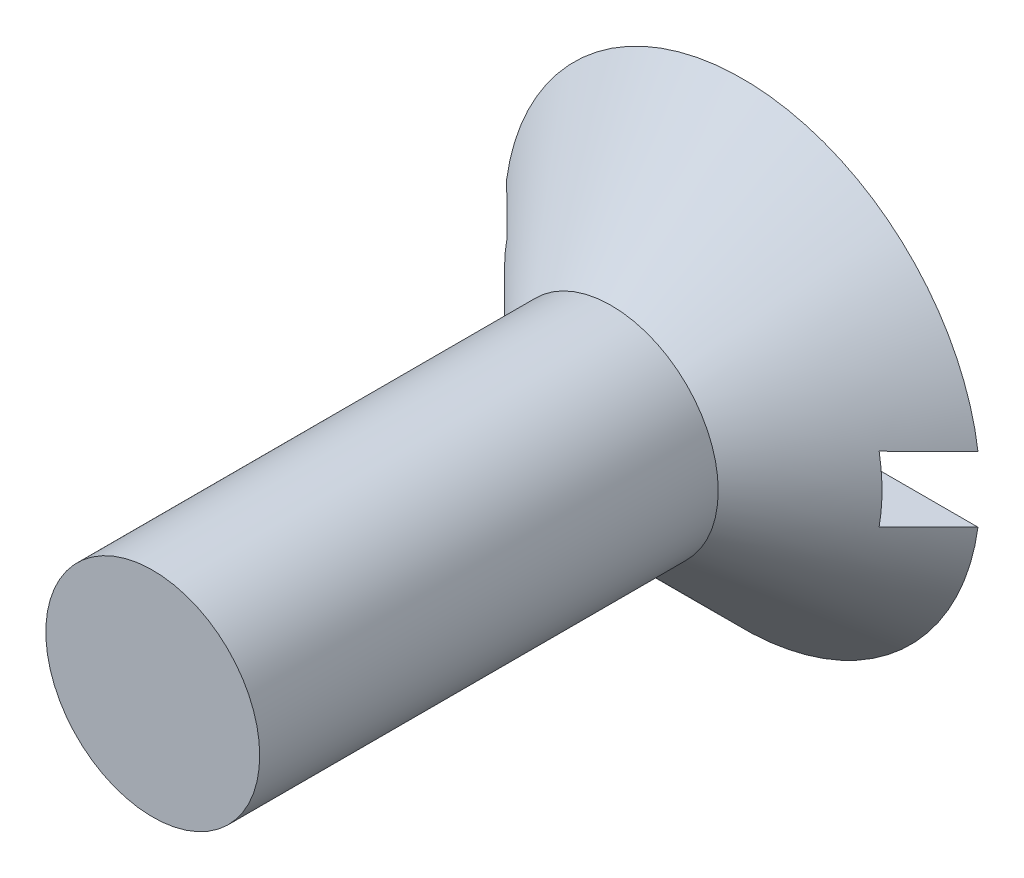
ISO-10303-21;
HEADER;
FILE_DESCRIPTION(('STEP AP214'),'2;1');
FILE_NAME('part.step','',(''),(''),'','','');
FILE_SCHEMA(('AUTOMOTIVE_DESIGN { 1 0 10303 214 1 1 1 1 }'));
ENDSEC;
DATA;
#1=APPLICATION_CONTEXT('core data for automotive mechanical design processes');
#2=APPLICATION_PROTOCOL_DEFINITION('international standard','automotive_design',2000,#1);
#3=PRODUCT_CONTEXT('',#1,'mechanical');
#4=PRODUCT('Part','Part','',(#3));
#5=PRODUCT_RELATED_PRODUCT_CATEGORY('part','',(#4));
#6=PRODUCT_DEFINITION_FORMATION('','',#4);
#7=PRODUCT_DEFINITION_CONTEXT('part definition',#1,'design');
#8=PRODUCT_DEFINITION('design','',#6,#7);
#9=PRODUCT_DEFINITION_SHAPE('','',#8);
#10=(LENGTH_UNIT() NAMED_UNIT(*) SI_UNIT(.MILLI.,.METRE.));
#11=(NAMED_UNIT(*) PLANE_ANGLE_UNIT() SI_UNIT($,.RADIAN.));
#12=(NAMED_UNIT(*) SI_UNIT($,.STERADIAN.) SOLID_ANGLE_UNIT());
#13=UNCERTAINTY_MEASURE_WITH_UNIT(LENGTH_MEASURE(1.E-05),#10,'distance_accuracy_value','');
#14=(GEOMETRIC_REPRESENTATION_CONTEXT(3) GLOBAL_UNCERTAINTY_ASSIGNED_CONTEXT((#13)) GLOBAL_UNIT_ASSIGNED_CONTEXT((#10,
#11,#12)) REPRESENTATION_CONTEXT('',''));
#15=CARTESIAN_POINT('',(0.,0.,0.));
#16=DIRECTION('',(0.,0.,1.));
#17=DIRECTION('',(1.,0.,0.));
#18=AXIS2_PLACEMENT_3D('',#15,#16,#17);
#19=CARTESIAN_POINT('',(0.,0.,0.));
#20=DIRECTION('',(0.,0.,1.));
#21=DIRECTION('',(1.,0.,0.));
#22=AXIS2_PLACEMENT_3D('',#19,#20,#21);
#23=PLANE('',#22);
#24=CARTESIAN_POINT('',(0.,0.,0.));
#25=DIRECTION('',(0.,0.,1.));
#26=DIRECTION('',(1.,0.,0.));
#27=AXIS2_PLACEMENT_3D('',#24,#25,#26);
#28=CIRCLE('',#27,7.265);
#29=CARTESIAN_POINT('',(-7.19584776103553,-1.,0.));
#30=VERTEX_POINT('',#29);
#31=CARTESIAN_POINT('',(7.19584776103553,-1.,0.));
#32=VERTEX_POINT('',#31);
#33=EDGE_CURVE('E94',#30,#32,#28,.T.);
#34=ORIENTED_EDGE('',*,*,#33,.F.);
#35=DIRECTION('',(-1.,0.,0.));
#36=VECTOR('',#35,1.);
#37=CARTESIAN_POINT('',(7.5,-1.,0.));
#38=LINE('',#37,#36);
#39=EDGE_CURVE('E88',#32,#30,#38,.T.);
#40=ORIENTED_EDGE('',*,*,#39,.F.);
#41=EDGE_LOOP('',(#34,#40));
#42=FACE_BOUND('',#41,.T.);
#43=ADVANCED_FACE('F33',(#42),#23,.F.);
#44=CARTESIAN_POINT('',(7.19584776103553,1.,0.));
#45=VERTEX_POINT('',#44);
#46=CARTESIAN_POINT('',(-7.19584776103553,1.,0.));
#47=VERTEX_POINT('',#46);
#48=EDGE_CURVE('E87',#45,#47,#28,.T.);
#49=ORIENTED_EDGE('',*,*,#48,.F.);
#50=DIRECTION('',(1.,0.,0.));
#51=VECTOR('',#50,1.);
#52=CARTESIAN_POINT('',(7.5,1.,0.));
#53=LINE('',#52,#51);
#54=EDGE_CURVE('E80',#47,#45,#53,.T.);
#55=ORIENTED_EDGE('',*,*,#54,.F.);
#56=EDGE_LOOP('',(#49,#55));
#57=FACE_BOUND('',#56,.T.);
#58=ADVANCED_FACE('F35',(#57),#23,.F.);
#59=CARTESIAN_POINT('',(0.,0.,0.));
#60=DIRECTION('',(0.,0.,-1.));
#61=DIRECTION('',(-1.,0.,0.));
#62=AXIS2_PLACEMENT_3D('',#59,#60,#61);
#63=CONICAL_SURFACE('',#62,7.265,0.785398163397447);
#64=CARTESIAN_POINT('',(0.,0.,1.5));
#65=DIRECTION('',(0.,0.,1.));
#66=DIRECTION('',(1.,0.,0.));
#67=AXIS2_PLACEMENT_3D('',#64,#65,#66);
#68=CIRCLE('',#67,5.765);
#69=CARTESIAN_POINT('',(-5.67760733055748,1.,1.5));
#70=VERTEX_POINT('',#69);
#71=CARTESIAN_POINT('',(-5.67760733055748,-1.,1.5));
#72=VERTEX_POINT('',#71);
#73=EDGE_CURVE('E59',#70,#72,#68,.T.);
#74=ORIENTED_EDGE('',*,*,#73,.T.);
#75=CARTESIAN_POINT('',(15.9983096562298,-1.,-8.76453249026987));
#76=CARTESIAN_POINT('',(15.4557890476047,-1.,-8.22307645823843));
#77=CARTESIAN_POINT('',(14.9132222529746,-1.,-7.6816666771709));
#78=CARTESIAN_POINT('',(13.8279300255945,-1.,-6.59898819730665));
#79=CARTESIAN_POINT('',(13.2852045903701,-1.,-6.0577195009906));
#80=CARTESIAN_POINT('',(12.1993480385048,-1.,-4.97519157531993));
#81=CARTESIAN_POINT('',(11.6562168460853,-1.,-4.43393242196489));
#82=CARTESIAN_POINT('',(10.56964954414,-1.,-3.35173778518174));
#83=CARTESIAN_POINT('',(10.0262134396754,-1.,-2.81080229667209));
#84=CARTESIAN_POINT('',(8.91636492247909,-1.,-1.70706536962148));
#85=CARTESIAN_POINT('',(8.34993173988591,-1.,-1.14428480390768));
#86=CARTESIAN_POINT('',(7.49954017689733,-1.,-0.300833009918018));
#87=CARTESIAN_POINT('',(7.21594550764785,-1.,-0.0197951541063598));
#88=CARTESIAN_POINT('',(6.64840977604114,-1.,0.541927813486278));
#89=CARTESIAN_POINT('',(6.3644687154152,-1.,0.822612927016182));
#90=CARTESIAN_POINT('',(5.79614600574115,-1.,1.38340433997221));
#91=CARTESIAN_POINT('',(5.51176447505103,-1.,1.66351075924745));
#92=CARTESIAN_POINT('',(4.94220523196698,-1.,2.22292392481321));
#93=CARTESIAN_POINT('',(4.65702750445391,-1.,2.50223065571147));
#94=CARTESIAN_POINT('',(4.08539864007565,-1.,3.0594910862045));
#95=CARTESIAN_POINT('',(3.79894761970735,-1.,3.33744490489673));
#96=CARTESIAN_POINT('',(3.36742298623154,-1.,3.75244649130769));
#97=CARTESIAN_POINT('',(3.22327563390415,-1.,3.89045674274514));
#98=CARTESIAN_POINT('',(2.93407333321084,-1.,4.16552238124412));
#99=CARTESIAN_POINT('',(2.78901839595447,-1.,4.30257777995054));
#100=CARTESIAN_POINT('',(2.60420862865773,-1.,4.4754272339185));
#101=CARTESIAN_POINT('',(2.56509643854745,-1.,4.51190850437038));
#102=CARTESIAN_POINT('',(2.48675714779063,-1.,4.58474771323964));
#103=CARTESIAN_POINT('',(2.44753004678473,-1.,4.62110565127055));
#104=CARTESIAN_POINT('',(2.32965338430296,-1.,4.72997048279937));
#105=CARTESIAN_POINT('',(2.25080958589758,-1.,4.80226734208624));
#106=CARTESIAN_POINT('',(2.09275614932205,-1.,4.94583310653702));
#107=CARTESIAN_POINT('',(2.01354918103263,-1.,5.01710494163445));
#108=CARTESIAN_POINT('',(1.85422849249175,-1.,5.15862082160274));
#109=CARTESIAN_POINT('',(1.77411480474968,-1.,5.22886490311678));
#110=CARTESIAN_POINT('',(1.58590225366499,-1.,5.39095618793656));
#111=CARTESIAN_POINT('',(1.4773225357401,-1.,5.48225313997696));
#112=CARTESIAN_POINT('',(1.31134376059791,-1.,5.6161921741658));
#113=CARTESIAN_POINT('',(1.25528814192237,-1.,5.66049417970092));
#114=CARTESIAN_POINT('',(1.14196556107815,-1.,5.7475152186001));
#115=CARTESIAN_POINT('',(1.08469876181978,-1.,5.79023446275368));
#116=CARTESIAN_POINT('',(0.967613118494528,-1.,5.8741096784269));
#117=CARTESIAN_POINT('',(0.907768002224852,-1.,5.91522928963622));
#118=CARTESIAN_POINT('',(0.785742515037642,-1.,5.99408800409892));
#119=CARTESIAN_POINT('',(0.72355925106915,-1.,6.03182270977622));
#120=CARTESIAN_POINT('',(0.59692783330777,-1.,6.10157843721879));
#121=CARTESIAN_POINT('',(0.532513341037853,-1.,6.13365937476086));
#122=CARTESIAN_POINT('',(0.400212712405025,-1.,6.18953804214339));
#123=CARTESIAN_POINT('',(0.332338512899856,-1.,6.21336229882671));
#124=CARTESIAN_POINT('',(0.230146192650823,-1.,6.23934779198065));
#125=CARTESIAN_POINT('',(0.197045598105046,-1.,6.24630409711196));
#126=CARTESIAN_POINT('',(0.130328550980707,-1.,6.25707955216794));
#127=CARTESIAN_POINT('',(0.096712147208895,-1.,6.26089899706559));
#128=CARTESIAN_POINT('',(0.0293528962342801,-1.,6.26513184684099));
#129=CARTESIAN_POINT('',(-0.0043893506239799,-1.,6.26555457204965));
#130=CARTESIAN_POINT('',(-0.0717374624353494,-1.,6.26299712959929));
#131=CARTESIAN_POINT('',(-0.105343315977113,-1.,6.26001668287271));
#132=CARTESIAN_POINT('',(-0.2049244462689,-1.,6.24631485812493));
#133=CARTESIAN_POINT('',(-0.270280804754342,-1.,6.23086607143081));
#134=CARTESIAN_POINT('',(-0.366030087054957,-1.,6.20055766001401));
#135=CARTESIAN_POINT('',(-0.397655355234753,-1.,6.18922164128592));
#136=CARTESIAN_POINT('',(-0.460133893136234,-1.,6.1645884798906));
#137=CARTESIAN_POINT('',(-0.490987315028977,-1.,6.15129172740731));
#138=CARTESIAN_POINT('',(-0.582573972400191,-1.,6.1089549739208));
#139=CARTESIAN_POINT('',(-0.642190739233886,-1.,6.07751723536106));
#140=CARTESIAN_POINT('',(-0.759048768503682,-1.,6.01046061904964));
#141=CARTESIAN_POINT('',(-0.816287030885016,-1.,5.97483666560303));
#142=CARTESIAN_POINT('',(-0.929128702049539,-1.,5.90064340100099));
#143=CARTESIAN_POINT('',(-0.984724766945417,-1.,5.8620630202428));
#144=CARTESIAN_POINT('',(-1.09446906586818,-1.,5.78296783074429));
#145=CARTESIAN_POINT('',(-1.1486179892555,-1.,5.74245396961619));
#146=CARTESIAN_POINT('',(-1.25639642418024,-1.,5.65959234865027));
#147=CARTESIAN_POINT('',(-1.31001451009564,-1.,5.61722979841428));
#148=CARTESIAN_POINT('',(-1.41640290679354,-1.,5.53144621073864));
#149=CARTESIAN_POINT('',(-1.46917312957924,-1.,5.48802506459328));
#150=CARTESIAN_POINT('',(-1.57391303615265,-1.,5.40049537283036));
#151=CARTESIAN_POINT('',(-1.62588440224883,-1.,5.35638883530661));
#152=CARTESIAN_POINT('',(-1.72929437221973,-1.,5.26756142000487));
#153=CARTESIAN_POINT('',(-1.78073299945704,-1.,5.22284056936862));
#154=CARTESIAN_POINT('',(-1.93221886800848,-1.,5.08988012428591));
#155=CARTESIAN_POINT('',(-2.03166628391237,-1.,5.00095760586113));
#156=CARTESIAN_POINT('',(-2.22946236636678,-1.,4.82189704116501));
#157=CARTESIAN_POINT('',(-2.32781099004341,-1.,4.73175894776378));
#158=CARTESIAN_POINT('',(-2.52373423455357,-1.,4.55062339597674));
#159=CARTESIAN_POINT('',(-2.62130876281639,-1.,4.4596258375787));
#160=CARTESIAN_POINT('',(-2.81587971500281,-1.,4.2770142958724));
#161=CARTESIAN_POINT('',(-2.91287613467913,-1.,4.18540030804584));
#162=CARTESIAN_POINT('',(-3.20345002105372,-1.,3.9096582041107));
#163=CARTESIAN_POINT('',(-3.39637895208703,-1.,3.72484708582212));
#164=CARTESIAN_POINT('',(-3.78117934483303,-1.,3.35415679971514));
#165=CARTESIAN_POINT('',(-3.97305087845589,-1.,3.16827770632708));
#166=CARTESIAN_POINT('',(-4.35411723555848,-1.,2.79774374490212));
#167=CARTESIAN_POINT('',(-4.54331917342883,-1.,2.61309619033792));
#168=CARTESIAN_POINT('',(-4.92125838088143,-1.,2.24331976434325));
#169=CARTESIAN_POINT('',(-5.10999564208373,-1.,2.05819088435457));
#170=CARTESIAN_POINT('',(-5.67553571499023,-1.,1.50246978172238));
#171=CARTESIAN_POINT('',(-6.05184188549579,-1.,1.13137229296147));
#172=CARTESIAN_POINT('',(-6.82468826303074,-1.,0.367701969882598));
#173=CARTESIAN_POINT('',(-7.22118596330345,-1.,-0.0249138309707284));
#174=CARTESIAN_POINT('',(-8.01367181290951,-1.,-0.810661051260227));
#175=CARTESIAN_POINT('',(-8.40965996108909,-1.,-1.20379247185985));
#176=CARTESIAN_POINT('',(-9.59728686641382,-1.,-2.38382349981805));
#177=CARTESIAN_POINT('',(-10.3884392451929,-1.,-3.17121247278217));
#178=CARTESIAN_POINT('',(-11.9830042385384,-1.,-4.75945288575233));
#179=CARTESIAN_POINT('',(-12.786406576409,-1.,-5.56031463722744));
#180=CARTESIAN_POINT('',(-13.9911504653319,-1.,-6.76181131211687));
#181=CARTESIAN_POINT('',(-14.3926327100833,-1.,-7.16230516533003));
#182=CARTESIAN_POINT('',(-15.1955224445601,-1.,-7.96336757118446));
#183=CARTESIAN_POINT('',(-15.5969299343066,-1.,-8.36393612380456));
#184=CARTESIAN_POINT('',(-15.9983096562298,-1.,-8.76453249026987));
#185=B_SPLINE_CURVE_WITH_KNOTS('',3,(#75,#76,#77,#78,#79,#80,#81,#82,#83,#84,#85,#86,#87,#88,
#89,#90,#91,#92,#93,#94,#95,#96,#97,#98,#99,#100,#101,#102,#103,#104,#105,#106,#107,#108,#109,
#110,#111,#112,#113,#114,#115,#116,#117,#118,#119,#120,#121,#122,#123,#124,#125,#126,#127,#128,
#129,#130,#131,#132,#133,#134,#135,#136,#137,#138,#139,#140,#141,#142,#143,#144,#145,#146,#147,
#148,#149,#150,#151,#152,#153,#154,#155,#156,#157,#158,#159,#160,#161,#162,#163,#164,#165,#166,
#167,#168,#169,#170,#171,#172,#173,#174,#175,#176,#177,#178,#179,#180,#181,#182,#183,#184),
.UNSPECIFIED.,.F.,.F.,(4,2,2,2,2,2,2,2,2,2,2,2,2,2,2,2,2,2,2,2,2,2,2,2,2,2,2,2,2,2,2,2,2,2,2,2,
2,2,2,2,2,2,2,2,2,2,2,2,2,2,2,2,2,2,4),(0.,2.29946283186032,4.59896368303261,6.8993063128362,
9.19961182627363,11.5950476639415,12.792826184088,13.990598741935,15.1880916209582,
16.3856073962152,17.5830157746448,18.1817017291386,18.7803803695339,18.9408351829286,
19.1012904986632,19.4222057446186,19.7418551115428,20.0614930538872,20.4869936755256,
20.7013203725826,20.9156184226064,21.1333752973453,21.3514110980078,21.566975489411,
21.7818407575202,21.883184523014,21.9845187576089,22.0855748437795,22.1866392173659,
22.3869450817582,22.4876930970714,22.5884210906256,22.7903272598044,22.9924808120406,
23.1954322077902,23.3982851371626,23.6032682523545,23.8082725063766,24.0127601258155,
24.2172387394063,24.6174372398075,25.0176513014433,25.4179125225543,25.8181766806981,
26.6196607890434,27.4210897012471,28.2142017587871,29.0073280160263,30.5928467725497,
32.2668290270087,33.9408150651803,37.2894155672119,40.6925777753173,42.3938272676703,
44.0950762783655),.UNSPECIFIED.);
#186=EDGE_CURVE('E11',#72,#30,#185,.T.);
#187=ORIENTED_EDGE('',*,*,#186,.T.);
#188=ORIENTED_EDGE('',*,*,#33,.T.);
#189=CARTESIAN_POINT('',(5.67760733055748,-1.,1.5));
#190=VERTEX_POINT('',#189);
#191=EDGE_CURVE('E37',#32,#190,#185,.T.);
#192=ORIENTED_EDGE('',*,*,#191,.T.);
#193=CARTESIAN_POINT('',(5.67760733055748,1.,1.5));
#194=VERTEX_POINT('',#193);
#195=EDGE_CURVE('E93',#190,#194,#68,.T.);
#196=ORIENTED_EDGE('',*,*,#195,.T.);
#197=CARTESIAN_POINT('',(-15.9983096562298,1.,-8.76453249026987));
#198=CARTESIAN_POINT('',(-15.4557890476047,1.,-8.22307645823843));
#199=CARTESIAN_POINT('',(-14.9132222529746,1.,-7.6816666771709));
#200=CARTESIAN_POINT('',(-13.8279300255945,1.,-6.59898819730665));
#201=CARTESIAN_POINT('',(-13.2852045903701,1.,-6.05771950099059));
#202=CARTESIAN_POINT('',(-12.1993480385048,1.,-4.97519157531993));
#203=CARTESIAN_POINT('',(-11.6562168460853,1.,-4.43393242196488));
#204=CARTESIAN_POINT('',(-10.56964954414,1.,-3.35173778518173));
#205=CARTESIAN_POINT('',(-10.0262134396754,1.,-2.81080229667208));
#206=CARTESIAN_POINT('',(-8.91636492247908,1.,-1.70706536962147));
#207=CARTESIAN_POINT('',(-8.3499317398859,1.,-1.14428480390767));
#208=CARTESIAN_POINT('',(-7.49954017689732,1.,-0.300833009918011));
#209=CARTESIAN_POINT('',(-7.21594550764784,1.,-0.0197951541063512));
#210=CARTESIAN_POINT('',(-6.64840977604113,1.,0.541927813486287));
#211=CARTESIAN_POINT('',(-6.36446871541519,1.,0.82261292701619));
#212=CARTESIAN_POINT('',(-5.79614600574114,1.,1.38340433997222));
#213=CARTESIAN_POINT('',(-5.51176447505102,1.,1.66351075924746));
#214=CARTESIAN_POINT('',(-4.94220523196697,1.,2.22292392481322));
#215=CARTESIAN_POINT('',(-4.6570275044539,1.,2.50223065571147));
#216=CARTESIAN_POINT('',(-4.08539864007564,1.,3.05949108620451));
#217=CARTESIAN_POINT('',(-3.79894761970735,1.,3.33744490489674));
#218=CARTESIAN_POINT('',(-3.36742298623154,1.,3.75244649130769));
#219=CARTESIAN_POINT('',(-3.22327563390414,1.,3.89045674274515));
#220=CARTESIAN_POINT('',(-2.93407333321084,1.,4.16552238124412));
#221=CARTESIAN_POINT('',(-2.78901839595447,1.,4.30257777995054));
#222=CARTESIAN_POINT('',(-2.60420862865773,1.,4.4754272339185));
#223=CARTESIAN_POINT('',(-2.56509643854745,1.,4.51190850437038));
#224=CARTESIAN_POINT('',(-2.48675714779064,1.,4.58474771323964));
#225=CARTESIAN_POINT('',(-2.44753004678473,1.,4.62110565127055));
#226=CARTESIAN_POINT('',(-2.32965338430296,1.,4.72997048279937));
#227=CARTESIAN_POINT('',(-2.25080958589758,1.,4.80226734208624));
#228=CARTESIAN_POINT('',(-2.09275614932205,1.,4.94583310653702));
#229=CARTESIAN_POINT('',(-2.01354918103263,1.,5.01710494163445));
#230=CARTESIAN_POINT('',(-1.85422849249175,1.,5.15862082160274));
#231=CARTESIAN_POINT('',(-1.77411480474967,1.,5.22886490311678));
#232=CARTESIAN_POINT('',(-1.58590225366499,1.,5.39095618793656));
#233=CARTESIAN_POINT('',(-1.4773225357401,1.,5.48225313997696));
#234=CARTESIAN_POINT('',(-1.31134376059791,1.,5.6161921741658));
#235=CARTESIAN_POINT('',(-1.25528814192237,1.,5.66049417970092));
#236=CARTESIAN_POINT('',(-1.14196556107815,1.,5.7475152186001));
#237=CARTESIAN_POINT('',(-1.08469876181978,1.,5.79023446275368));
#238=CARTESIAN_POINT('',(-0.967613118494526,1.,5.8741096784269));
#239=CARTESIAN_POINT('',(-0.90776800222485,1.,5.91522928963622));
#240=CARTESIAN_POINT('',(-0.78574251503764,1.,5.99408800409892));
#241=CARTESIAN_POINT('',(-0.723559251069148,1.,6.03182270977622));
#242=CARTESIAN_POINT('',(-0.596927833307768,1.,6.10157843721879));
#243=CARTESIAN_POINT('',(-0.532513341037851,1.,6.13365937476086));
#244=CARTESIAN_POINT('',(-0.400212712405023,1.,6.18953804214339));
#245=CARTESIAN_POINT('',(-0.332338512899854,1.,6.21336229882671));
#246=CARTESIAN_POINT('',(-0.230146192650822,1.,6.23934779198065));
#247=CARTESIAN_POINT('',(-0.197045598105046,1.,6.24630409711196));
#248=CARTESIAN_POINT('',(-0.130328550980708,1.,6.25707955216793));
#249=CARTESIAN_POINT('',(-0.0967121472088963,1.,6.26089899706559));
#250=CARTESIAN_POINT('',(-0.0293528962342817,1.,6.26513184684099));
#251=CARTESIAN_POINT('',(0.00438935062397831,1.,6.26555457204965));
#252=CARTESIAN_POINT('',(0.0717374624353489,1.,6.26299712959929));
#253=CARTESIAN_POINT('',(0.105343315977113,1.,6.26001668287271));
#254=CARTESIAN_POINT('',(0.204924446268901,1.,6.24631485812493));
#255=CARTESIAN_POINT('',(0.270280804754341,1.,6.2308660714308));
#256=CARTESIAN_POINT('',(0.366030087054956,1.,6.20055766001401));
#257=CARTESIAN_POINT('',(0.397655355234752,1.,6.18922164128592));
#258=CARTESIAN_POINT('',(0.460133893136235,1.,6.1645884798906));
#259=CARTESIAN_POINT('',(0.490987315028978,1.,6.15129172740731));
#260=CARTESIAN_POINT('',(0.582573972400192,1.,6.1089549739208));
#261=CARTESIAN_POINT('',(0.642190739233886,1.,6.07751723536106));
#262=CARTESIAN_POINT('',(0.759048768503682,1.,6.01046061904964));
#263=CARTESIAN_POINT('',(0.816287030885017,1.,5.97483666560303));
#264=CARTESIAN_POINT('',(0.929128702049539,1.,5.90064340100099));
#265=CARTESIAN_POINT('',(0.984724766945417,1.,5.8620630202428));
#266=CARTESIAN_POINT('',(1.09446906586818,1.,5.78296783074429));
#267=CARTESIAN_POINT('',(1.1486179892555,1.,5.74245396961619));
#268=CARTESIAN_POINT('',(1.25639642418024,1.,5.65959234865027));
#269=CARTESIAN_POINT('',(1.31001451009564,1.,5.61722979841428));
#270=CARTESIAN_POINT('',(1.41640290679355,1.,5.53144621073863));
#271=CARTESIAN_POINT('',(1.46917312957925,1.,5.48802506459327));
#272=CARTESIAN_POINT('',(1.57391303615266,1.,5.40049537283035));
#273=CARTESIAN_POINT('',(1.62588440224884,1.,5.3563888353066));
#274=CARTESIAN_POINT('',(1.72929437221973,1.,5.26756142000487));
#275=CARTESIAN_POINT('',(1.78073299945705,1.,5.22284056936862));
#276=CARTESIAN_POINT('',(1.93221886800848,1.,5.0898801242859));
#277=CARTESIAN_POINT('',(2.03166628391238,1.,5.00095760586112));
#278=CARTESIAN_POINT('',(2.22946236636679,1.,4.821897041165));
#279=CARTESIAN_POINT('',(2.32781099004342,1.,4.73175894776377));
#280=CARTESIAN_POINT('',(2.52373423455357,1.,4.55062339597673));
#281=CARTESIAN_POINT('',(2.6213087628164,1.,4.45962583757869));
#282=CARTESIAN_POINT('',(2.81587971500281,1.,4.27701429587239));
#283=CARTESIAN_POINT('',(2.91287613467914,1.,4.18540030804583));
#284=CARTESIAN_POINT('',(3.20345002105373,1.,3.9096582041107));
#285=CARTESIAN_POINT('',(3.39637895208704,1.,3.72484708582211));
#286=CARTESIAN_POINT('',(3.78117934483304,1.,3.35415679971513));
#287=CARTESIAN_POINT('',(3.9730508784559,1.,3.16827770632707));
#288=CARTESIAN_POINT('',(4.3541172355585,1.,2.7977437449021));
#289=CARTESIAN_POINT('',(4.54331917342884,1.,2.61309619033791));
#290=CARTESIAN_POINT('',(4.92125838088145,1.,2.24331976434323));
#291=CARTESIAN_POINT('',(5.10999564208374,1.,2.05819088435455));
#292=CARTESIAN_POINT('',(5.67553571499025,1.,1.50246978172236));
#293=CARTESIAN_POINT('',(6.05184188549581,1.,1.13137229296145));
#294=CARTESIAN_POINT('',(6.82468826303076,1.,0.367701969882577));
#295=CARTESIAN_POINT('',(7.22118596330347,1.,-0.0249138309707471));
#296=CARTESIAN_POINT('',(8.01367181290953,1.,-0.810661051260242));
#297=CARTESIAN_POINT('',(8.40965996108911,1.,-1.20379247185986));
#298=CARTESIAN_POINT('',(9.59728686641384,1.,-2.38382349981806));
#299=CARTESIAN_POINT('',(10.3884392451929,1.,-3.17121247278218));
#300=CARTESIAN_POINT('',(11.9830042385384,1.,-4.75945288575234));
#301=CARTESIAN_POINT('',(12.786406576409,1.,-5.56031463722745));
#302=CARTESIAN_POINT('',(13.9911504653319,1.,-6.76181131211687));
#303=CARTESIAN_POINT('',(14.3926327100833,1.,-7.16230516533003));
#304=CARTESIAN_POINT('',(15.1955224445601,1.,-7.96336757118446));
#305=CARTESIAN_POINT('',(15.5969299343066,1.,-8.36393612380456));
#306=CARTESIAN_POINT('',(15.9983096562298,1.,-8.76453249026987));
#307=B_SPLINE_CURVE_WITH_KNOTS('',3,(#197,#198,#199,#200,#201,#202,#203,#204,#205,#206,#207,
#208,#209,#210,#211,#212,#213,#214,#215,#216,#217,#218,#219,#220,#221,#222,#223,#224,#225,#226,
#227,#228,#229,#230,#231,#232,#233,#234,#235,#236,#237,#238,#239,#240,#241,#242,#243,#244,#245,
#246,#247,#248,#249,#250,#251,#252,#253,#254,#255,#256,#257,#258,#259,#260,#261,#262,#263,#264,
#265,#266,#267,#268,#269,#270,#271,#272,#273,#274,#275,#276,#277,#278,#279,#280,#281,#282,#283,
#284,#285,#286,#287,#288,#289,#290,#291,#292,#293,#294,#295,#296,#297,#298,#299,#300,#301,#302,
#303,#304,#305,#306),.UNSPECIFIED.,.F.,.F.,(4,2,2,2,2,2,2,2,2,2,2,2,2,2,2,2,2,2,2,2,2,2,2,2,2,2,
2,2,2,2,2,2,2,2,2,2,2,2,2,2,2,2,2,2,2,2,2,2,2,2,2,2,2,2,4),(0.,2.29946283186032,
4.59896368303262,6.89930631283621,9.19961182627364,11.5950476639415,12.792826184088,
13.990598741935,15.1880916209582,16.3856073962152,17.5830157746448,18.1817017291386,
18.7803803695339,18.9408351829286,19.1012904986632,19.4222057446186,19.7418551115428,
20.0614930538872,20.4869936755256,20.7013203725826,20.9156184226064,21.1333752973453,
21.3514110980078,21.5669754894111,21.7818407575202,21.883184523014,21.9845187576089,
22.0855748437795,22.1866392173659,22.3869450817582,22.4876930970714,22.5884210906256,
22.7903272598044,22.9924808120406,23.1954322077902,23.3982851371626,23.6032682523545,
23.8082725063766,24.0127601258155,24.2172387394063,24.6174372398075,25.0176513014433,
25.4179125225543,25.8181766806981,26.6196607890434,27.4210897012471,28.2142017587872,
29.0073280160263,30.5928467725497,32.2668290270087,33.9408150651803,37.2894155672119,
40.6925777753173,42.3938272676703,44.0950762783655),.UNSPECIFIED.);
#308=EDGE_CURVE('E84',#194,#45,#307,.T.);
#309=ORIENTED_EDGE('',*,*,#308,.T.);
#310=ORIENTED_EDGE('',*,*,#48,.T.);
#311=EDGE_CURVE('E47',#47,#70,#307,.T.);
#312=ORIENTED_EDGE('',*,*,#311,.T.);
#313=EDGE_LOOP('',(#74,#187,#188,#192,#196,#309,#310,#312));
#314=FACE_BOUND('',#313,.T.);
#315=CARTESIAN_POINT('',(0.,0.,4.));
#316=DIRECTION('',(0.,0.,1.));
#317=DIRECTION('',(1.,0.,0.));
#318=AXIS2_PLACEMENT_3D('',#315,#316,#317);
#319=CIRCLE('',#318,3.265);
#320=CARTESIAN_POINT('',(3.265,0.,4.));
#321=VERTEX_POINT('',#320);
#322=EDGE_CURVE('E98',#321,#321,#319,.T.);
#323=ORIENTED_EDGE('',*,*,#322,.F.);
#324=EDGE_LOOP('',(#323));
#325=FACE_BOUND('',#324,.T.);
#326=ADVANCED_FACE('F90',(#314,#325),#63,.T.);
#327=CARTESIAN_POINT('',(0.,0.,18.));
#328=DIRECTION('',(0.,0.,1.));
#329=DIRECTION('',(1.,0.,0.));
#330=AXIS2_PLACEMENT_3D('',#327,#328,#329);
#331=CYLINDRICAL_SURFACE('',#330,3.265);
#332=CARTESIAN_POINT('',(0.,0.,18.));
#333=DIRECTION('',(0.,0.,1.));
#334=DIRECTION('',(1.,0.,0.));
#335=AXIS2_PLACEMENT_3D('',#332,#333,#334);
#336=CIRCLE('',#335,3.265);
#337=CARTESIAN_POINT('',(3.265,0.,18.));
#338=VERTEX_POINT('',#337);
#339=EDGE_CURVE('E137',#338,#338,#336,.T.);
#340=ORIENTED_EDGE('',*,*,#339,.F.);
#341=EDGE_LOOP('',(#340));
#342=FACE_BOUND('',#341,.T.);
#343=ORIENTED_EDGE('',*,*,#322,.T.);
#344=EDGE_LOOP('',(#343));
#345=FACE_BOUND('',#344,.T.);
#346=ADVANCED_FACE('F117',(#342,#345),#331,.T.);
#347=CARTESIAN_POINT('',(0.,3.265,18.));
#348=DIRECTION('',(0.,0.,-1.));
#349=DIRECTION('',(-1.,0.,0.));
#350=AXIS2_PLACEMENT_3D('',#347,#348,#349);
#351=PLANE('',#350);
#352=ORIENTED_EDGE('',*,*,#339,.T.);
#353=EDGE_LOOP('',(#352));
#354=FACE_BOUND('',#353,.T.);
#355=ADVANCED_FACE('F115',(#354),#351,.F.);
#356=CARTESIAN_POINT('',(7.5,-1.,1.5));
#357=DIRECTION('',(0.,-1.,0.));
#358=DIRECTION('',(0.,0.,-1.));
#359=AXIS2_PLACEMENT_3D('',#356,#357,#358);
#360=PLANE('',#359);
#361=ORIENTED_EDGE('',*,*,#39,.T.);
#362=ORIENTED_EDGE('',*,*,#186,.F.);
#363=DIRECTION('',(-1.,0.,0.));
#364=VECTOR('',#363,1.);
#365=CARTESIAN_POINT('',(7.5,-1.,1.5));
#366=LINE('',#365,#364);
#367=EDGE_CURVE('E136',#190,#72,#366,.T.);
#368=ORIENTED_EDGE('',*,*,#367,.F.);
#369=ORIENTED_EDGE('',*,*,#191,.F.);
#370=EDGE_LOOP('',(#361,#362,#368,#369));
#371=FACE_BOUND('',#370,.T.);
#372=ADVANCED_FACE('F112',(#371),#360,.F.);
#373=CARTESIAN_POINT('',(7.5,1.,1.5));
#374=DIRECTION('',(0.,1.,0.));
#375=DIRECTION('',(0.,0.,1.));
#376=AXIS2_PLACEMENT_3D('',#373,#374,#375);
#377=PLANE('',#376);
#378=ORIENTED_EDGE('',*,*,#54,.T.);
#379=ORIENTED_EDGE('',*,*,#308,.F.);
#380=DIRECTION('',(1.,0.,0.));
#381=VECTOR('',#380,1.);
#382=CARTESIAN_POINT('',(7.5,1.,1.5));
#383=LINE('',#382,#381);
#384=EDGE_CURVE('E54',#70,#194,#383,.T.);
#385=ORIENTED_EDGE('',*,*,#384,.F.);
#386=ORIENTED_EDGE('',*,*,#311,.F.);
#387=EDGE_LOOP('',(#378,#379,#385,#386));
#388=FACE_BOUND('',#387,.T.);
#389=ADVANCED_FACE('F79',(#388),#377,.F.);
#390=CARTESIAN_POINT('',(0.,0.,1.5));
#391=DIRECTION('',(0.,0.,1.));
#392=DIRECTION('',(1.,0.,0.));
#393=AXIS2_PLACEMENT_3D('',#390,#391,#392);
#394=PLANE('',#393);
#395=ORIENTED_EDGE('',*,*,#384,.T.);
#396=ORIENTED_EDGE('',*,*,#195,.F.);
#397=ORIENTED_EDGE('',*,*,#367,.T.);
#398=ORIENTED_EDGE('',*,*,#73,.F.);
#399=EDGE_LOOP('',(#395,#396,#397,#398));
#400=FACE_BOUND('',#399,.T.);
#401=ADVANCED_FACE('F111',(#400),#394,.F.);
#402=CLOSED_SHELL('',(#43,#58,#326,#346,#355,#372,#389,#401));
#403=MANIFOLD_SOLID_BREP('B2',#402);
#404=ADVANCED_BREP_SHAPE_REPRESENTATION('',(#18,#403),#14);
#405=SHAPE_DEFINITION_REPRESENTATION(#9,#404);
ENDSEC;
END-ISO-10303-21;
